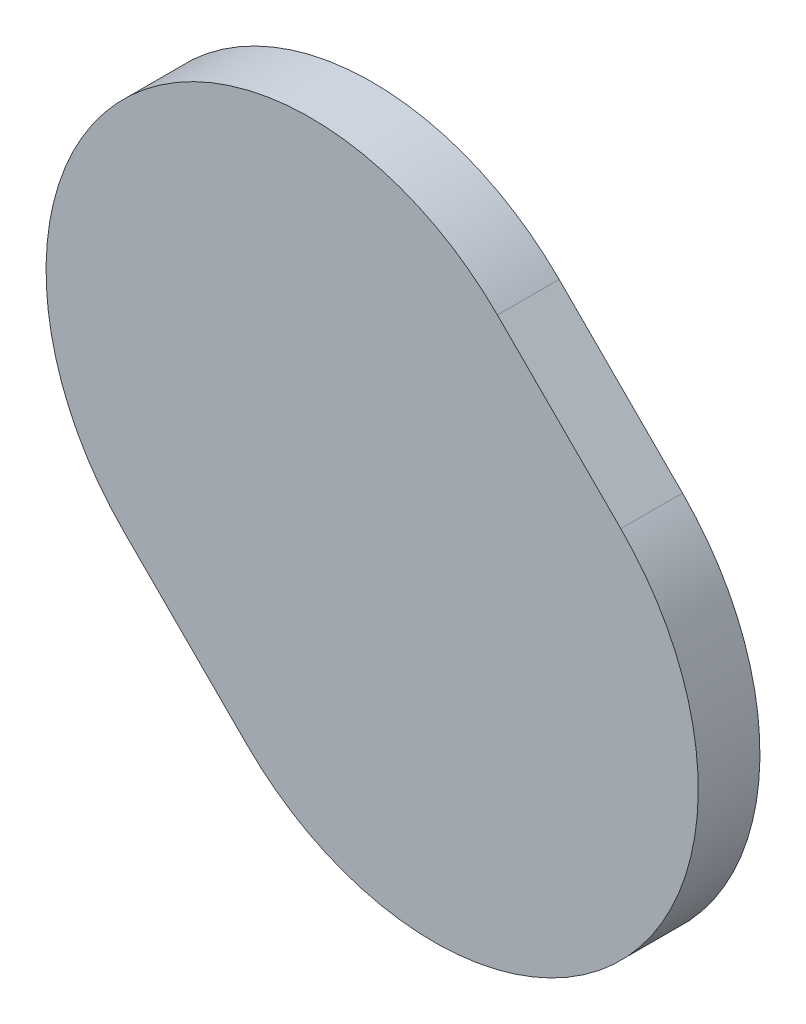
ISO-10303-21;
HEADER;
FILE_DESCRIPTION(('STEP AP214'),'2;1');
FILE_NAME('part.step','',(''),(''),'','','');
FILE_SCHEMA(('AUTOMOTIVE_DESIGN { 1 0 10303 214 1 1 1 1 }'));
ENDSEC;
DATA;
#1=APPLICATION_CONTEXT('core data for automotive mechanical design processes');
#2=APPLICATION_PROTOCOL_DEFINITION('international standard','automotive_design',2000,#1);
#3=PRODUCT_CONTEXT('',#1,'mechanical');
#4=PRODUCT('Part','Part','',(#3));
#5=PRODUCT_RELATED_PRODUCT_CATEGORY('part','',(#4));
#6=PRODUCT_DEFINITION_FORMATION('','',#4);
#7=PRODUCT_DEFINITION_CONTEXT('part definition',#1,'design');
#8=PRODUCT_DEFINITION('design','',#6,#7);
#9=PRODUCT_DEFINITION_SHAPE('','',#8);
#10=(LENGTH_UNIT() NAMED_UNIT(*) SI_UNIT(.MILLI.,.METRE.));
#11=(NAMED_UNIT(*) PLANE_ANGLE_UNIT() SI_UNIT($,.RADIAN.));
#12=(NAMED_UNIT(*) SI_UNIT($,.STERADIAN.) SOLID_ANGLE_UNIT());
#13=UNCERTAINTY_MEASURE_WITH_UNIT(LENGTH_MEASURE(1.E-05),#10,'distance_accuracy_value','');
#14=(GEOMETRIC_REPRESENTATION_CONTEXT(3) GLOBAL_UNCERTAINTY_ASSIGNED_CONTEXT((#13)) GLOBAL_UNIT_ASSIGNED_CONTEXT((#10,
#11,#12)) REPRESENTATION_CONTEXT('',''));
#15=CARTESIAN_POINT('',(0.,0.,0.));
#16=DIRECTION('',(0.,0.,1.));
#17=DIRECTION('',(1.,0.,0.));
#18=AXIS2_PLACEMENT_3D('',#15,#16,#17);
#19=CARTESIAN_POINT('',(82.943933,-129.886066,1.635));
#20=DIRECTION('',(0.,0.,1.));
#21=DIRECTION('',(1.,0.,0.));
#22=AXIS2_PLACEMENT_3D('',#19,#20,#21);
#23=PLANE('',#22);
#24=DIRECTION('',(0.707106781186548,-0.707106781186548,0.));
#25=VECTOR('',#24,1.);
#26=CARTESIAN_POINT('',(82.943933,-129.886066,1.635));
#27=LINE('',#26,#25);
#28=CARTESIAN_POINT('',(82.943933,-129.886066,1.635));
#29=VERTEX_POINT('',#28);
#30=CARTESIAN_POINT('',(83.013933,-129.956066,1.635));
#31=VERTEX_POINT('',#30);
#32=EDGE_CURVE('E81',#29,#31,#27,.T.);
#33=ORIENTED_EDGE('',*,*,#32,.T.);
#34=CARTESIAN_POINT('',(83.1199995,-129.8499995,1.635));
#35=DIRECTION('',(0.,0.,1.));
#36=DIRECTION('',(-0.707106781186548,-0.707106781186548,0.));
#37=AXIS2_PLACEMENT_3D('',#34,#35,#36);
#38=CIRCLE('',#37,0.150000682813);
#39=CARTESIAN_POINT('',(83.226066,-129.743933,1.635));
#40=VERTEX_POINT('',#39);
#41=EDGE_CURVE('E107',#31,#40,#38,.T.);
#42=ORIENTED_EDGE('',*,*,#41,.T.);
#43=DIRECTION('',(-0.707106781187048,0.707106781186048,0.));
#44=VECTOR('',#43,1.);
#45=CARTESIAN_POINT('',(83.226066,-129.743933,1.635));
#46=LINE('',#45,#44);
#47=CARTESIAN_POINT('',(83.156066,-129.673933,1.635));
#48=VERTEX_POINT('',#47);
#49=EDGE_CURVE('E74',#40,#48,#46,.T.);
#50=ORIENTED_EDGE('',*,*,#49,.T.);
#51=CARTESIAN_POINT('',(83.0499995,-129.7799995,1.635));
#52=DIRECTION('',(0.,0.,1.));
#53=DIRECTION('',(0.707106781186548,0.707106781186548,0.));
#54=AXIS2_PLACEMENT_3D('',#51,#52,#53);
#55=CIRCLE('',#54,0.150000682813);
#56=EDGE_CURVE('E11',#48,#29,#55,.T.);
#57=ORIENTED_EDGE('',*,*,#56,.T.);
#58=EDGE_LOOP('',(#33,#42,#50,#57));
#59=FACE_BOUND('',#58,.T.);
#60=ADVANCED_FACE('F17',(#59),#23,.T.);
#61=CARTESIAN_POINT('',(82.943933,-129.886066,1.6));
#62=DIRECTION('',(0.,0.,1.));
#63=DIRECTION('',(1.,0.,0.));
#64=AXIS2_PLACEMENT_3D('',#61,#62,#63);
#65=PLANE('',#64);
#66=CARTESIAN_POINT('',(83.0499995,-129.7799995,1.6));
#67=DIRECTION('',(0.,0.,1.));
#68=DIRECTION('',(0.707106781186548,0.707106781186548,0.));
#69=AXIS2_PLACEMENT_3D('',#66,#67,#68);
#70=CIRCLE('',#69,0.150000682813);
#71=CARTESIAN_POINT('',(83.156066,-129.673933,1.6));
#72=VERTEX_POINT('',#71);
#73=CARTESIAN_POINT('',(82.943933,-129.886066,1.6));
#74=VERTEX_POINT('',#73);
#75=EDGE_CURVE('E25',#72,#74,#70,.T.);
#76=ORIENTED_EDGE('',*,*,#75,.F.);
#77=DIRECTION('',(-0.707106781187048,0.707106781186048,0.));
#78=VECTOR('',#77,1.);
#79=CARTESIAN_POINT('',(83.226066,-129.743933,1.6));
#80=LINE('',#79,#78);
#81=CARTESIAN_POINT('',(83.226066,-129.743933,1.6));
#82=VERTEX_POINT('',#81);
#83=EDGE_CURVE('E100',#82,#72,#80,.T.);
#84=ORIENTED_EDGE('',*,*,#83,.F.);
#85=CARTESIAN_POINT('',(83.1199995,-129.8499995,1.6));
#86=DIRECTION('',(0.,0.,1.));
#87=DIRECTION('',(-0.707106781186548,-0.707106781186548,0.));
#88=AXIS2_PLACEMENT_3D('',#85,#86,#87);
#89=CIRCLE('',#88,0.150000682813);
#90=CARTESIAN_POINT('',(83.013933,-129.956066,1.6));
#91=VERTEX_POINT('',#90);
#92=EDGE_CURVE('E83',#91,#82,#89,.T.);
#93=ORIENTED_EDGE('',*,*,#92,.F.);
#94=DIRECTION('',(0.707106781186548,-0.707106781186548,0.));
#95=VECTOR('',#94,1.);
#96=CARTESIAN_POINT('',(82.943933,-129.886066,1.6));
#97=LINE('',#96,#95);
#98=EDGE_CURVE('E79',#74,#91,#97,.T.);
#99=ORIENTED_EDGE('',*,*,#98,.F.);
#100=EDGE_LOOP('',(#76,#84,#93,#99));
#101=FACE_BOUND('',#100,.T.);
#102=ADVANCED_FACE('F85',(#101),#65,.F.);
#103=CARTESIAN_POINT('',(83.0499995,-129.7799995,1.6));
#104=DIRECTION('',(0.,0.,-1.));
#105=DIRECTION('',(0.707106781186548,0.707106781186548,0.));
#106=AXIS2_PLACEMENT_3D('',#103,#104,#105);
#107=CYLINDRICAL_SURFACE('',#106,0.150000682813);
#108=ORIENTED_EDGE('',*,*,#75,.T.);
#109=DIRECTION('',(0.,0.,1.));
#110=VECTOR('',#109,1.);
#111=CARTESIAN_POINT('',(82.943933,-129.886066,1.6));
#112=LINE('',#111,#110);
#113=EDGE_CURVE('E68',#74,#29,#112,.T.);
#114=ORIENTED_EDGE('',*,*,#113,.T.);
#115=ORIENTED_EDGE('',*,*,#56,.F.);
#116=DIRECTION('',(0.,0.,1.));
#117=VECTOR('',#116,1.);
#118=CARTESIAN_POINT('',(83.156066,-129.673933,1.6));
#119=LINE('',#118,#117);
#120=EDGE_CURVE('E71',#72,#48,#119,.T.);
#121=ORIENTED_EDGE('',*,*,#120,.F.);
#122=EDGE_LOOP('',(#108,#114,#115,#121));
#123=FACE_BOUND('',#122,.T.);
#124=ADVANCED_FACE('F67',(#123),#107,.T.);
#125=CARTESIAN_POINT('',(83.226066,-129.743933,1.6));
#126=DIRECTION('',(-0.707106781186048,-0.707106781187048,0.));
#127=DIRECTION('',(-0.707106781187048,0.707106781186048,0.));
#128=AXIS2_PLACEMENT_3D('',#125,#126,#127);
#129=PLANE('',#128);
#130=ORIENTED_EDGE('',*,*,#83,.T.);
#131=ORIENTED_EDGE('',*,*,#120,.T.);
#132=ORIENTED_EDGE('',*,*,#49,.F.);
#133=DIRECTION('',(0.,0.,1.));
#134=VECTOR('',#133,1.);
#135=CARTESIAN_POINT('',(83.226066,-129.743933,1.6));
#136=LINE('',#135,#134);
#137=EDGE_CURVE('E103',#82,#40,#136,.T.);
#138=ORIENTED_EDGE('',*,*,#137,.F.);
#139=EDGE_LOOP('',(#130,#131,#132,#138));
#140=FACE_BOUND('',#139,.T.);
#141=ADVANCED_FACE('F119',(#140),#129,.F.);
#142=CARTESIAN_POINT('',(83.1199995,-129.8499995,1.6));
#143=DIRECTION('',(0.,0.,-1.));
#144=DIRECTION('',(-0.707106781186548,-0.707106781186548,0.));
#145=AXIS2_PLACEMENT_3D('',#142,#143,#144);
#146=CYLINDRICAL_SURFACE('',#145,0.150000682813);
#147=ORIENTED_EDGE('',*,*,#92,.T.);
#148=ORIENTED_EDGE('',*,*,#137,.T.);
#149=ORIENTED_EDGE('',*,*,#41,.F.);
#150=DIRECTION('',(0.,0.,1.));
#151=VECTOR('',#150,1.);
#152=CARTESIAN_POINT('',(83.013933,-129.956066,1.6));
#153=LINE('',#152,#151);
#154=EDGE_CURVE('E89',#91,#31,#153,.T.);
#155=ORIENTED_EDGE('',*,*,#154,.F.);
#156=EDGE_LOOP('',(#147,#148,#149,#155));
#157=FACE_BOUND('',#156,.T.);
#158=ADVANCED_FACE('F121',(#157),#146,.T.);
#159=CARTESIAN_POINT('',(82.943933,-129.886066,1.6));
#160=DIRECTION('',(0.707106781186548,0.707106781186548,0.));
#161=DIRECTION('',(0.,0.,-1.));
#162=AXIS2_PLACEMENT_3D('',#159,#160,#161);
#163=PLANE('',#162);
#164=ORIENTED_EDGE('',*,*,#98,.T.);
#165=ORIENTED_EDGE('',*,*,#154,.T.);
#166=ORIENTED_EDGE('',*,*,#32,.F.);
#167=ORIENTED_EDGE('',*,*,#113,.F.);
#168=EDGE_LOOP('',(#164,#165,#166,#167));
#169=FACE_BOUND('',#168,.T.);
#170=ADVANCED_FACE('F77',(#169),#163,.F.);
#171=CLOSED_SHELL('',(#60,#102,#124,#141,#158,#170));
#172=MANIFOLD_SOLID_BREP('B1',#171);
#173=ADVANCED_BREP_SHAPE_REPRESENTATION('',(#18,#172),#14);
#174=SHAPE_DEFINITION_REPRESENTATION(#9,#173);
ENDSEC;
END-ISO-10303-21;
